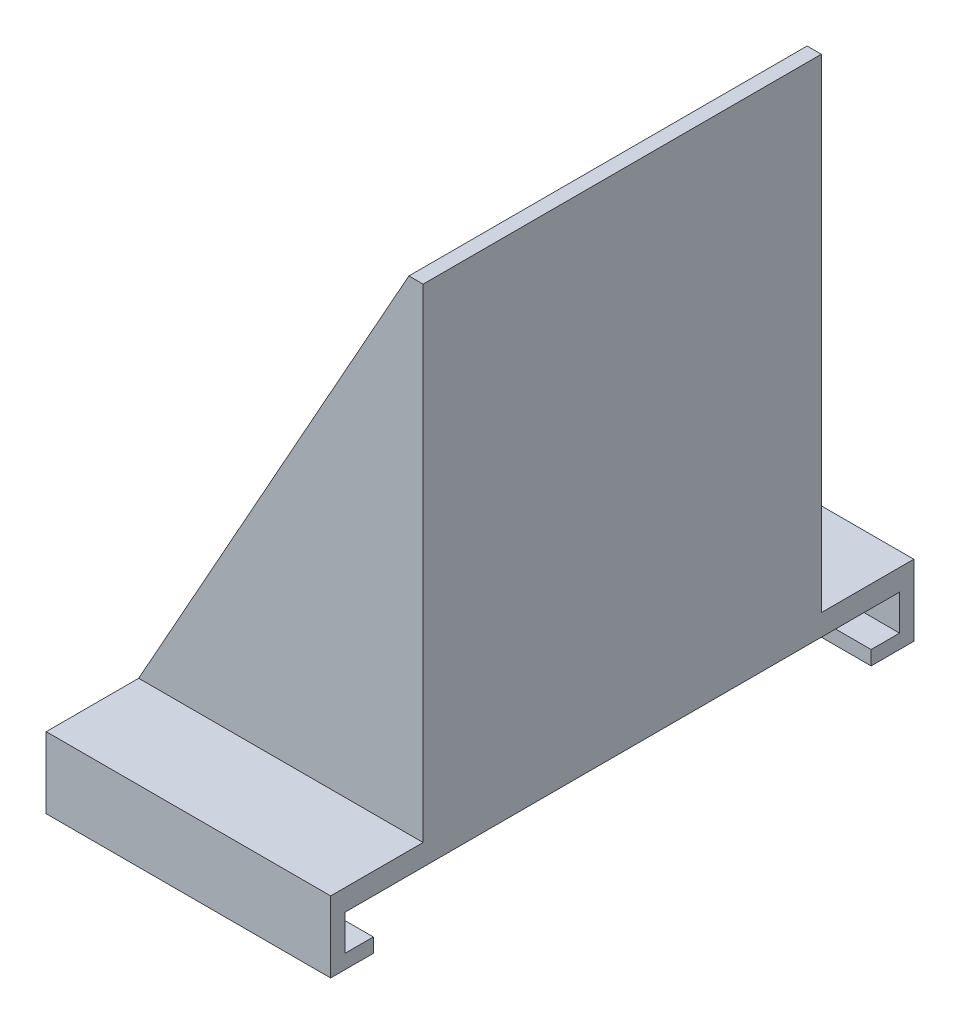
ISO-10303-21;
HEADER;
FILE_DESCRIPTION(('STEP AP214'),'2;1');
FILE_NAME('part.step','',(''),(''),'','','');
FILE_SCHEMA(('AUTOMOTIVE_DESIGN { 1 0 10303 214 1 1 1 1 }'));
ENDSEC;
DATA;
#1=APPLICATION_CONTEXT('core data for automotive mechanical design processes');
#2=APPLICATION_PROTOCOL_DEFINITION('international standard','automotive_design',2000,#1);
#3=PRODUCT_CONTEXT('',#1,'mechanical');
#4=PRODUCT('Part','Part','',(#3));
#5=PRODUCT_RELATED_PRODUCT_CATEGORY('part','',(#4));
#6=PRODUCT_DEFINITION_FORMATION('','',#4);
#7=PRODUCT_DEFINITION_CONTEXT('part definition',#1,'design');
#8=PRODUCT_DEFINITION('design','',#6,#7);
#9=PRODUCT_DEFINITION_SHAPE('','',#8);
#10=(LENGTH_UNIT() NAMED_UNIT(*) SI_UNIT(.MILLI.,.METRE.));
#11=(NAMED_UNIT(*) PLANE_ANGLE_UNIT() SI_UNIT($,.RADIAN.));
#12=(NAMED_UNIT(*) SI_UNIT($,.STERADIAN.) SOLID_ANGLE_UNIT());
#13=UNCERTAINTY_MEASURE_WITH_UNIT(LENGTH_MEASURE(1.E-05),#10,'distance_accuracy_value','');
#14=(GEOMETRIC_REPRESENTATION_CONTEXT(3) GLOBAL_UNCERTAINTY_ASSIGNED_CONTEXT((#13)) GLOBAL_UNIT_ASSIGNED_CONTEXT((#10,
#11,#12)) REPRESENTATION_CONTEXT('',''));
#15=CARTESIAN_POINT('',(0.,0.,0.));
#16=DIRECTION('',(0.,0.,1.));
#17=DIRECTION('',(1.,0.,0.));
#18=AXIS2_PLACEMENT_3D('',#15,#16,#17);
#19=CARTESIAN_POINT('',(51.1489361702127,0.,0.));
#20=DIRECTION('',(-1.,0.,0.));
#21=DIRECTION('',(0.,0.,1.));
#22=AXIS2_PLACEMENT_3D('',#19,#20,#21);
#23=PLANE('',#22);
#24=DIRECTION('',(0.,0.,-1.));
#25=VECTOR('',#24,1.);
#26=CARTESIAN_POINT('',(51.1489361702127,3.5,0.));
#27=LINE('',#26,#25);
#28=CARTESIAN_POINT('',(51.1489361702127,3.5,10.322695035461));
#29=VERTEX_POINT('',#28);
#30=CARTESIAN_POINT('',(51.1489361702127,3.5,-15.677304964539));
#31=VERTEX_POINT('',#30);
#32=EDGE_CURVE('E50',#29,#31,#27,.T.);
#33=ORIENTED_EDGE('',*,*,#32,.F.);
#34=DIRECTION('',(0.,1.,0.));
#35=VECTOR('',#34,1.);
#36=CARTESIAN_POINT('',(51.1489361702127,1.5,10.322695035461));
#37=LINE('',#36,#35);
#38=CARTESIAN_POINT('',(51.1489361702127,35.5,10.322695035461));
#39=VERTEX_POINT('',#38);
#40=EDGE_CURVE('E185',#29,#39,#37,.T.);
#41=ORIENTED_EDGE('',*,*,#40,.T.);
#42=DIRECTION('',(0.,0.,1.));
#43=VECTOR('',#42,1.);
#44=CARTESIAN_POINT('',(51.1489361702127,35.5,11.322695035461));
#45=LINE('',#44,#43);
#46=CARTESIAN_POINT('',(51.1489361702127,35.5,-15.677304964539));
#47=VERTEX_POINT('',#46);
#48=EDGE_CURVE('E205',#47,#39,#45,.T.);
#49=ORIENTED_EDGE('',*,*,#48,.F.);
#50=DIRECTION('',(0.,-1.,0.));
#51=VECTOR('',#50,1.);
#52=CARTESIAN_POINT('',(51.1489361702127,1.5,-15.677304964539));
#53=LINE('',#52,#51);
#54=EDGE_CURVE('E181',#47,#31,#53,.T.);
#55=ORIENTED_EDGE('',*,*,#54,.T.);
#56=EDGE_LOOP('',(#33,#41,#49,#55));
#57=FACE_BOUND('',#56,.T.);
#58=ADVANCED_FACE('F35',(#57),#23,.T.);
#59=CARTESIAN_POINT('',(0.,1.5,0.));
#60=DIRECTION('',(0.,1.,0.));
#61=DIRECTION('',(0.,0.,1.));
#62=AXIS2_PLACEMENT_3D('',#59,#60,#61);
#63=PLANE('',#62);
#64=DIRECTION('',(1.,0.,0.));
#65=VECTOR('',#64,1.);
#66=CARTESIAN_POINT('',(51.1489361702127,1.5,11.322695035461));
#67=LINE('',#66,#65);
#68=CARTESIAN_POINT('',(32.1489361702127,1.5,11.322695035461));
#69=VERTEX_POINT('',#68);
#70=CARTESIAN_POINT('',(52.1489361702127,1.5,11.322695035461));
#71=VERTEX_POINT('',#70);
#72=EDGE_CURVE('E215',#69,#71,#67,.T.);
#73=ORIENTED_EDGE('',*,*,#72,.F.);
#74=DIRECTION('',(0.,0.,1.));
#75=VECTOR('',#74,1.);
#76=CARTESIAN_POINT('',(32.1489361702127,1.5,-23.177304964539));
#77=LINE('',#76,#75);
#78=CARTESIAN_POINT('',(32.1489361702127,1.5,17.822695035461));
#79=VERTEX_POINT('',#78);
#80=EDGE_CURVE('E297',#69,#79,#77,.T.);
#81=ORIENTED_EDGE('',*,*,#80,.T.);
#82=DIRECTION('',(1.,0.,0.));
#83=VECTOR('',#82,1.);
#84=CARTESIAN_POINT('',(32.1489361702127,1.5,17.822695035461));
#85=LINE('',#84,#83);
#86=CARTESIAN_POINT('',(52.1489361702127,1.5,17.822695035461));
#87=VERTEX_POINT('',#86);
#88=EDGE_CURVE('E296',#79,#87,#85,.T.);
#89=ORIENTED_EDGE('',*,*,#88,.T.);
#90=DIRECTION('',(0.,0.,-1.));
#91=VECTOR('',#90,1.);
#92=CARTESIAN_POINT('',(52.1489361702127,1.5,-23.177304964539));
#93=LINE('',#92,#91);
#94=EDGE_CURVE('E300',#87,#71,#93,.T.);
#95=ORIENTED_EDGE('',*,*,#94,.T.);
#96=EDGE_LOOP('',(#73,#81,#89,#95));
#97=FACE_BOUND('',#96,.T.);
#98=ADVANCED_FACE('F339',(#97),#63,.T.);
#99=CARTESIAN_POINT('',(0.,0.,0.));
#100=DIRECTION('',(0.,1.,0.));
#101=DIRECTION('',(0.,0.,1.));
#102=AXIS2_PLACEMENT_3D('',#99,#100,#101);
#103=PLANE('',#102);
#104=DIRECTION('',(0.,0.,1.));
#105=VECTOR('',#104,1.);
#106=CARTESIAN_POINT('',(32.1489361702127,0.,-23.177304964539));
#107=LINE('',#106,#105);
#108=CARTESIAN_POINT('',(32.1489361702127,0.,-22.177304964539));
#109=VERTEX_POINT('',#108);
#110=CARTESIAN_POINT('',(32.1489361702127,0.,16.822695035461));
#111=VERTEX_POINT('',#110);
#112=EDGE_CURVE('E284',#109,#111,#107,.T.);
#113=ORIENTED_EDGE('',*,*,#112,.F.);
#114=DIRECTION('',(1.,0.,0.));
#115=VECTOR('',#114,1.);
#116=CARTESIAN_POINT('',(32.1489361702127,0.,-22.177304964539));
#117=LINE('',#116,#115);
#118=CARTESIAN_POINT('',(52.1489361702127,0.,-22.177304964539));
#119=VERTEX_POINT('',#118);
#120=EDGE_CURVE('E248',#109,#119,#117,.T.);
#121=ORIENTED_EDGE('',*,*,#120,.T.);
#122=DIRECTION('',(0.,0.,-1.));
#123=VECTOR('',#122,1.);
#124=CARTESIAN_POINT('',(52.1489361702127,0.,-23.177304964539));
#125=LINE('',#124,#123);
#126=CARTESIAN_POINT('',(52.1489361702127,0.,16.822695035461));
#127=VERTEX_POINT('',#126);
#128=EDGE_CURVE('E307',#127,#119,#125,.T.);
#129=ORIENTED_EDGE('',*,*,#128,.F.);
#130=DIRECTION('',(1.,0.,0.));
#131=VECTOR('',#130,1.);
#132=CARTESIAN_POINT('',(32.1489361702127,0.,16.822695035461));
#133=LINE('',#132,#131);
#134=EDGE_CURVE('E281',#111,#127,#133,.T.);
#135=ORIENTED_EDGE('',*,*,#134,.F.);
#136=EDGE_LOOP('',(#113,#121,#129,#135));
#137=FACE_BOUND('',#136,.T.);
#138=ADVANCED_FACE('F369',(#137),#103,.F.);
#139=CARTESIAN_POINT('',(32.1489361702127,1.5,-23.177304964539));
#140=DIRECTION('',(1.,0.,0.));
#141=DIRECTION('',(0.,0.,-1.));
#142=AXIS2_PLACEMENT_3D('',#139,#140,#141);
#143=PLANE('',#142);
#144=DIRECTION('',(0.,-1.,0.));
#145=VECTOR('',#144,1.);
#146=CARTESIAN_POINT('',(32.1489361702127,1.5,-23.177304964539));
#147=LINE('',#146,#145);
#148=CARTESIAN_POINT('',(32.1489361702127,1.5,-23.177304964539));
#149=VERTEX_POINT('',#148);
#150=CARTESIAN_POINT('',(32.1489361702127,-3.5,-23.177304964539));
#151=VERTEX_POINT('',#150);
#152=EDGE_CURVE('E305',#149,#151,#147,.T.);
#153=ORIENTED_EDGE('',*,*,#152,.T.);
#154=DIRECTION('',(0.,0.,-1.));
#155=VECTOR('',#154,1.);
#156=CARTESIAN_POINT('',(32.1489361702127,-3.5,-23.177304964539));
#157=LINE('',#156,#155);
#158=CARTESIAN_POINT('',(32.1489361702127,-3.5,-20.177304964539));
#159=VERTEX_POINT('',#158);
#160=EDGE_CURVE('E228',#159,#151,#157,.T.);
#161=ORIENTED_EDGE('',*,*,#160,.F.);
#162=DIRECTION('',(0.,-1.,0.));
#163=VECTOR('',#162,1.);
#164=CARTESIAN_POINT('',(32.1489361702127,-3.5,-20.177304964539));
#165=LINE('',#164,#163);
#166=CARTESIAN_POINT('',(32.1489361702127,-2.5,-20.177304964539));
#167=VERTEX_POINT('',#166);
#168=EDGE_CURVE('E224',#167,#159,#165,.T.);
#169=ORIENTED_EDGE('',*,*,#168,.F.);
#170=DIRECTION('',(0.,0.,1.));
#171=VECTOR('',#170,1.);
#172=CARTESIAN_POINT('',(32.1489361702127,-2.5,-20.177304964539));
#173=LINE('',#172,#171);
#174=CARTESIAN_POINT('',(32.1489361702127,-2.5,-22.177304964539));
#175=VERTEX_POINT('',#174);
#176=EDGE_CURVE('E221',#175,#167,#173,.T.);
#177=ORIENTED_EDGE('',*,*,#176,.F.);
#178=DIRECTION('',(0.,-1.,0.));
#179=VECTOR('',#178,1.);
#180=CARTESIAN_POINT('',(32.1489361702127,-2.5,-22.177304964539));
#181=LINE('',#180,#179);
#182=EDGE_CURVE('E231',#109,#175,#181,.T.);
#183=ORIENTED_EDGE('',*,*,#182,.F.);
#184=ORIENTED_EDGE('',*,*,#112,.T.);
#185=DIRECTION('',(0.,1.,0.));
#186=VECTOR('',#185,1.);
#187=CARTESIAN_POINT('',(32.1489361702127,-2.5,16.822695035461));
#188=LINE('',#187,#186);
#189=CARTESIAN_POINT('',(32.1489361702127,-2.5,16.822695035461));
#190=VERTEX_POINT('',#189);
#191=EDGE_CURVE('E267',#190,#111,#188,.T.);
#192=ORIENTED_EDGE('',*,*,#191,.F.);
#193=DIRECTION('',(0.,0.,1.));
#194=VECTOR('',#193,1.);
#195=CARTESIAN_POINT('',(32.1489361702127,-2.5,14.822695035461));
#196=LINE('',#195,#194);
#197=CARTESIAN_POINT('',(32.1489361702127,-2.5,14.822695035461));
#198=VERTEX_POINT('',#197);
#199=EDGE_CURVE('E264',#198,#190,#196,.T.);
#200=ORIENTED_EDGE('',*,*,#199,.F.);
#201=DIRECTION('',(0.,1.,0.));
#202=VECTOR('',#201,1.);
#203=CARTESIAN_POINT('',(32.1489361702127,-3.5,14.822695035461));
#204=LINE('',#203,#202);
#205=CARTESIAN_POINT('',(32.1489361702127,-3.5,14.822695035461));
#206=VERTEX_POINT('',#205);
#207=EDGE_CURVE('E260',#206,#198,#204,.T.);
#208=ORIENTED_EDGE('',*,*,#207,.F.);
#209=DIRECTION('',(0.,0.,-1.));
#210=VECTOR('',#209,1.);
#211=CARTESIAN_POINT('',(32.1489361702127,-3.5,17.822695035461));
#212=LINE('',#211,#210);
#213=CARTESIAN_POINT('',(32.1489361702127,-3.5,17.822695035461));
#214=VERTEX_POINT('',#213);
#215=EDGE_CURVE('E257',#214,#206,#212,.T.);
#216=ORIENTED_EDGE('',*,*,#215,.F.);
#217=DIRECTION('',(0.,-1.,0.));
#218=VECTOR('',#217,1.);
#219=CARTESIAN_POINT('',(32.1489361702127,1.5,17.822695035461));
#220=LINE('',#219,#218);
#221=EDGE_CURVE('E43',#79,#214,#220,.T.);
#222=ORIENTED_EDGE('',*,*,#221,.F.);
#223=ORIENTED_EDGE('',*,*,#80,.F.);
#224=DIRECTION('',(0.,0.,1.));
#225=VECTOR('',#224,1.);
#226=CARTESIAN_POINT('',(32.1489361702127,1.5,10.322695035461));
#227=LINE('',#226,#225);
#228=CARTESIAN_POINT('',(32.1489361702127,1.5,-16.677304964539));
#229=VERTEX_POINT('',#228);
#230=EDGE_CURVE('E196',#229,#69,#227,.T.);
#231=ORIENTED_EDGE('',*,*,#230,.F.);
#232=EDGE_CURVE('E293',#149,#229,#77,.T.);
#233=ORIENTED_EDGE('',*,*,#232,.F.);
#234=EDGE_LOOP('',(#153,#161,#169,#177,#183,#184,#192,#200,#208,#216,#222,#223,#231,#233));
#235=FACE_BOUND('',#234,.T.);
#236=ADVANCED_FACE('F37',(#235),#143,.F.);
#237=CARTESIAN_POINT('',(32.1489361702127,1.5,17.822695035461));
#238=DIRECTION('',(0.,0.,-1.));
#239=DIRECTION('',(-1.,0.,0.));
#240=AXIS2_PLACEMENT_3D('',#237,#238,#239);
#241=PLANE('',#240);
#242=ORIENTED_EDGE('',*,*,#221,.T.);
#243=DIRECTION('',(1.,0.,0.));
#244=VECTOR('',#243,1.);
#245=CARTESIAN_POINT('',(32.1489361702127,-3.5,17.822695035461));
#246=LINE('',#245,#244);
#247=CARTESIAN_POINT('',(52.1489361702127,-3.5,17.822695035461));
#248=VERTEX_POINT('',#247);
#249=EDGE_CURVE('E270',#214,#248,#246,.T.);
#250=ORIENTED_EDGE('',*,*,#249,.T.);
#251=DIRECTION('',(0.,-1.,0.));
#252=VECTOR('',#251,1.);
#253=CARTESIAN_POINT('',(52.1489361702127,1.5,17.822695035461));
#254=LINE('',#253,#252);
#255=EDGE_CURVE('E313',#87,#248,#254,.T.);
#256=ORIENTED_EDGE('',*,*,#255,.F.);
#257=ORIENTED_EDGE('',*,*,#88,.F.);
#258=EDGE_LOOP('',(#242,#250,#256,#257));
#259=FACE_BOUND('',#258,.T.);
#260=ADVANCED_FACE('F318',(#259),#241,.F.);
#261=CARTESIAN_POINT('',(52.1489361702127,1.5,-23.177304964539));
#262=DIRECTION('',(-1.,0.,0.));
#263=DIRECTION('',(0.,0.,1.));
#264=AXIS2_PLACEMENT_3D('',#261,#262,#263);
#265=PLANE('',#264);
#266=DIRECTION('',(0.,-1.,0.));
#267=VECTOR('',#266,1.);
#268=CARTESIAN_POINT('',(52.1489361702127,1.5,11.322695035461));
#269=LINE('',#268,#267);
#270=CARTESIAN_POINT('',(52.1489361702127,35.5,11.322695035461));
#271=VERTEX_POINT('',#270);
#272=EDGE_CURVE('E210',#271,#71,#269,.T.);
#273=ORIENTED_EDGE('',*,*,#272,.T.);
#274=ORIENTED_EDGE('',*,*,#94,.F.);
#275=ORIENTED_EDGE('',*,*,#255,.T.);
#276=DIRECTION('',(0.,0.,-1.));
#277=VECTOR('',#276,1.);
#278=CARTESIAN_POINT('',(52.1489361702127,-3.5,17.822695035461));
#279=LINE('',#278,#277);
#280=CARTESIAN_POINT('',(52.1489361702127,-3.5,14.822695035461));
#281=VERTEX_POINT('',#280);
#282=EDGE_CURVE('E247',#248,#281,#279,.T.);
#283=ORIENTED_EDGE('',*,*,#282,.T.);
#284=DIRECTION('',(0.,1.,0.));
#285=VECTOR('',#284,1.);
#286=CARTESIAN_POINT('',(52.1489361702127,-3.5,14.822695035461));
#287=LINE('',#286,#285);
#288=CARTESIAN_POINT('',(52.1489361702127,-2.5,14.822695035461));
#289=VERTEX_POINT('',#288);
#290=EDGE_CURVE('E273',#281,#289,#287,.T.);
#291=ORIENTED_EDGE('',*,*,#290,.T.);
#292=DIRECTION('',(0.,0.,1.));
#293=VECTOR('',#292,1.);
#294=CARTESIAN_POINT('',(52.1489361702127,-2.5,14.822695035461));
#295=LINE('',#294,#293);
#296=CARTESIAN_POINT('',(52.1489361702127,-2.5,16.822695035461));
#297=VERTEX_POINT('',#296);
#298=EDGE_CURVE('E276',#289,#297,#295,.T.);
#299=ORIENTED_EDGE('',*,*,#298,.T.);
#300=DIRECTION('',(0.,1.,0.));
#301=VECTOR('',#300,1.);
#302=CARTESIAN_POINT('',(52.1489361702127,-2.5,16.822695035461));
#303=LINE('',#302,#301);
#304=EDGE_CURVE('E261',#297,#127,#303,.T.);
#305=ORIENTED_EDGE('',*,*,#304,.T.);
#306=ORIENTED_EDGE('',*,*,#128,.T.);
#307=DIRECTION('',(0.,-1.,0.));
#308=VECTOR('',#307,1.);
#309=CARTESIAN_POINT('',(52.1489361702127,-2.5,-22.177304964539));
#310=LINE('',#309,#308);
#311=CARTESIAN_POINT('',(52.1489361702127,-2.5,-22.177304964539));
#312=VERTEX_POINT('',#311);
#313=EDGE_CURVE('E225',#119,#312,#310,.T.);
#314=ORIENTED_EDGE('',*,*,#313,.T.);
#315=DIRECTION('',(0.,0.,1.));
#316=VECTOR('',#315,1.);
#317=CARTESIAN_POINT('',(52.1489361702127,-2.5,-20.177304964539));
#318=LINE('',#317,#316);
#319=CARTESIAN_POINT('',(52.1489361702127,-2.5,-20.177304964539));
#320=VERTEX_POINT('',#319);
#321=EDGE_CURVE('E214',#312,#320,#318,.T.);
#322=ORIENTED_EDGE('',*,*,#321,.T.);
#323=DIRECTION('',(0.,-1.,0.));
#324=VECTOR('',#323,1.);
#325=CARTESIAN_POINT('',(52.1489361702127,-3.5,-20.177304964539));
#326=LINE('',#325,#324);
#327=CARTESIAN_POINT('',(52.1489361702127,-3.5,-20.177304964539));
#328=VERTEX_POINT('',#327);
#329=EDGE_CURVE('E237',#320,#328,#326,.T.);
#330=ORIENTED_EDGE('',*,*,#329,.T.);
#331=DIRECTION('',(0.,0.,-1.));
#332=VECTOR('',#331,1.);
#333=CARTESIAN_POINT('',(52.1489361702127,-3.5,-23.177304964539));
#334=LINE('',#333,#332);
#335=CARTESIAN_POINT('',(52.1489361702127,-3.5,-23.177304964539));
#336=VERTEX_POINT('',#335);
#337=EDGE_CURVE('E240',#328,#336,#334,.T.);
#338=ORIENTED_EDGE('',*,*,#337,.T.);
#339=DIRECTION('',(0.,-1.,0.));
#340=VECTOR('',#339,1.);
#341=CARTESIAN_POINT('',(52.1489361702127,1.5,-23.177304964539));
#342=LINE('',#341,#340);
#343=CARTESIAN_POINT('',(52.1489361702127,1.5,-23.177304964539));
#344=VERTEX_POINT('',#343);
#345=EDGE_CURVE('E311',#344,#336,#342,.T.);
#346=ORIENTED_EDGE('',*,*,#345,.F.);
#347=CARTESIAN_POINT('',(52.1489361702127,1.5,-16.677304964539));
#348=VERTEX_POINT('',#347);
#349=EDGE_CURVE('E299',#348,#344,#93,.T.);
#350=ORIENTED_EDGE('',*,*,#349,.F.);
#351=DIRECTION('',(0.,1.,0.));
#352=VECTOR('',#351,1.);
#353=CARTESIAN_POINT('',(52.1489361702127,1.5,-16.677304964539));
#354=LINE('',#353,#352);
#355=CARTESIAN_POINT('',(52.1489361702127,35.5,-16.677304964539));
#356=VERTEX_POINT('',#355);
#357=EDGE_CURVE('E57',#348,#356,#354,.T.);
#358=ORIENTED_EDGE('',*,*,#357,.T.);
#359=DIRECTION('',(0.,0.,1.));
#360=VECTOR('',#359,1.);
#361=CARTESIAN_POINT('',(52.1489361702127,35.5,11.322695035461));
#362=LINE('',#361,#360);
#363=EDGE_CURVE('E207',#356,#271,#362,.T.);
#364=ORIENTED_EDGE('',*,*,#363,.T.);
#365=EDGE_LOOP('',(#273,#274,#275,#283,#291,#299,#305,#306,#314,#322,#330,#338,#346,#350,#358,#364));
#366=FACE_BOUND('',#365,.T.);
#367=ADVANCED_FACE('F334',(#366),#265,.F.);
#368=CARTESIAN_POINT('',(32.1489361702127,1.5,-23.177304964539));
#369=DIRECTION('',(0.,0.,1.));
#370=DIRECTION('',(1.,0.,0.));
#371=AXIS2_PLACEMENT_3D('',#368,#369,#370);
#372=PLANE('',#371);
#373=ORIENTED_EDGE('',*,*,#345,.T.);
#374=DIRECTION('',(1.,0.,0.));
#375=VECTOR('',#374,1.);
#376=CARTESIAN_POINT('',(32.1489361702127,-3.5,-23.177304964539));
#377=LINE('',#376,#375);
#378=EDGE_CURVE('E251',#151,#336,#377,.T.);
#379=ORIENTED_EDGE('',*,*,#378,.F.);
#380=ORIENTED_EDGE('',*,*,#152,.F.);
#381=DIRECTION('',(-1.,0.,0.));
#382=VECTOR('',#381,1.);
#383=CARTESIAN_POINT('',(32.1489361702127,1.5,-23.177304964539));
#384=LINE('',#383,#382);
#385=EDGE_CURVE('E303',#344,#149,#384,.T.);
#386=ORIENTED_EDGE('',*,*,#385,.F.);
#387=EDGE_LOOP('',(#373,#379,#380,#386));
#388=FACE_BOUND('',#387,.T.);
#389=ADVANCED_FACE('F352',(#388),#372,.F.);
#390=ORIENTED_EDGE('',*,*,#232,.T.);
#391=DIRECTION('',(1.,0.,0.));
#392=VECTOR('',#391,1.);
#393=CARTESIAN_POINT('',(51.1489361702127,1.5,-16.677304964539));
#394=LINE('',#393,#392);
#395=EDGE_CURVE('E212',#229,#348,#394,.T.);
#396=ORIENTED_EDGE('',*,*,#395,.T.);
#397=ORIENTED_EDGE('',*,*,#349,.T.);
#398=ORIENTED_EDGE('',*,*,#385,.T.);
#399=EDGE_LOOP('',(#390,#396,#397,#398));
#400=FACE_BOUND('',#399,.T.);
#401=ADVANCED_FACE('F346',(#400),#63,.T.);
#402=CARTESIAN_POINT('',(32.1489361702127,-2.5,16.822695035461));
#403=DIRECTION('',(0.,0.,-1.));
#404=DIRECTION('',(-1.,0.,0.));
#405=AXIS2_PLACEMENT_3D('',#402,#403,#404);
#406=PLANE('',#405);
#407=ORIENTED_EDGE('',*,*,#304,.F.);
#408=DIRECTION('',(1.,0.,0.));
#409=VECTOR('',#408,1.);
#410=CARTESIAN_POINT('',(32.1489361702127,-2.5,16.822695035461));
#411=LINE('',#410,#409);
#412=EDGE_CURVE('E285',#190,#297,#411,.T.);
#413=ORIENTED_EDGE('',*,*,#412,.F.);
#414=ORIENTED_EDGE('',*,*,#191,.T.);
#415=ORIENTED_EDGE('',*,*,#134,.T.);
#416=EDGE_LOOP('',(#407,#413,#414,#415));
#417=FACE_BOUND('',#416,.T.);
#418=ADVANCED_FACE('F373',(#417),#406,.T.);
#419=CARTESIAN_POINT('',(32.1489361702127,-2.5,14.822695035461));
#420=DIRECTION('',(0.,1.,0.));
#421=DIRECTION('',(0.,0.,1.));
#422=AXIS2_PLACEMENT_3D('',#419,#420,#421);
#423=PLANE('',#422);
#424=ORIENTED_EDGE('',*,*,#298,.F.);
#425=DIRECTION('',(1.,0.,0.));
#426=VECTOR('',#425,1.);
#427=CARTESIAN_POINT('',(32.1489361702127,-2.5,14.822695035461));
#428=LINE('',#427,#426);
#429=EDGE_CURVE('E287',#198,#289,#428,.T.);
#430=ORIENTED_EDGE('',*,*,#429,.F.);
#431=ORIENTED_EDGE('',*,*,#199,.T.);
#432=ORIENTED_EDGE('',*,*,#412,.T.);
#433=EDGE_LOOP('',(#424,#430,#431,#432));
#434=FACE_BOUND('',#433,.T.);
#435=ADVANCED_FACE('F375',(#434),#423,.T.);
#436=CARTESIAN_POINT('',(32.1489361702127,-3.5,14.822695035461));
#437=DIRECTION('',(0.,0.,-1.));
#438=DIRECTION('',(-1.,0.,0.));
#439=AXIS2_PLACEMENT_3D('',#436,#437,#438);
#440=PLANE('',#439);
#441=ORIENTED_EDGE('',*,*,#290,.F.);
#442=DIRECTION('',(1.,0.,0.));
#443=VECTOR('',#442,1.);
#444=CARTESIAN_POINT('',(32.1489361702127,-3.5,14.822695035461));
#445=LINE('',#444,#443);
#446=EDGE_CURVE('E289',#206,#281,#445,.T.);
#447=ORIENTED_EDGE('',*,*,#446,.F.);
#448=ORIENTED_EDGE('',*,*,#207,.T.);
#449=ORIENTED_EDGE('',*,*,#429,.T.);
#450=EDGE_LOOP('',(#441,#447,#448,#449));
#451=FACE_BOUND('',#450,.T.);
#452=ADVANCED_FACE('F331',(#451),#440,.T.);
#453=CARTESIAN_POINT('',(32.1489361702127,-3.5,17.822695035461));
#454=DIRECTION('',(0.,-1.,0.));
#455=DIRECTION('',(0.,0.,-1.));
#456=AXIS2_PLACEMENT_3D('',#453,#454,#455);
#457=PLANE('',#456);
#458=ORIENTED_EDGE('',*,*,#282,.F.);
#459=ORIENTED_EDGE('',*,*,#249,.F.);
#460=ORIENTED_EDGE('',*,*,#215,.T.);
#461=ORIENTED_EDGE('',*,*,#446,.T.);
#462=EDGE_LOOP('',(#458,#459,#460,#461));
#463=FACE_BOUND('',#462,.T.);
#464=ADVANCED_FACE('F325',(#463),#457,.T.);
#465=CARTESIAN_POINT('',(32.1489361702127,-2.5,-20.177304964539));
#466=DIRECTION('',(0.,1.,0.));
#467=DIRECTION('',(0.,0.,1.));
#468=AXIS2_PLACEMENT_3D('',#465,#466,#467);
#469=PLANE('',#468);
#470=ORIENTED_EDGE('',*,*,#321,.F.);
#471=DIRECTION('',(1.,0.,0.));
#472=VECTOR('',#471,1.);
#473=CARTESIAN_POINT('',(32.1489361702127,-2.5,-22.177304964539));
#474=LINE('',#473,#472);
#475=EDGE_CURVE('E245',#175,#312,#474,.T.);
#476=ORIENTED_EDGE('',*,*,#475,.F.);
#477=ORIENTED_EDGE('',*,*,#176,.T.);
#478=DIRECTION('',(1.,0.,0.));
#479=VECTOR('',#478,1.);
#480=CARTESIAN_POINT('',(32.1489361702127,-2.5,-20.177304964539));
#481=LINE('',#480,#479);
#482=EDGE_CURVE('E234',#167,#320,#481,.T.);
#483=ORIENTED_EDGE('',*,*,#482,.T.);
#484=EDGE_LOOP('',(#470,#476,#477,#483));
#485=FACE_BOUND('',#484,.T.);
#486=ADVANCED_FACE('F363',(#485),#469,.T.);
#487=CARTESIAN_POINT('',(32.1489361702127,-2.5,-22.177304964539));
#488=DIRECTION('',(0.,0.,1.));
#489=DIRECTION('',(1.,0.,0.));
#490=AXIS2_PLACEMENT_3D('',#487,#488,#489);
#491=PLANE('',#490);
#492=ORIENTED_EDGE('',*,*,#313,.F.);
#493=ORIENTED_EDGE('',*,*,#120,.F.);
#494=ORIENTED_EDGE('',*,*,#182,.T.);
#495=ORIENTED_EDGE('',*,*,#475,.T.);
#496=EDGE_LOOP('',(#492,#493,#494,#495));
#497=FACE_BOUND('',#496,.T.);
#498=ADVANCED_FACE('F367',(#497),#491,.T.);
#499=CARTESIAN_POINT('',(32.1489361702127,-3.5,-23.177304964539));
#500=DIRECTION('',(0.,-1.,0.));
#501=DIRECTION('',(0.,0.,-1.));
#502=AXIS2_PLACEMENT_3D('',#499,#500,#501);
#503=PLANE('',#502);
#504=ORIENTED_EDGE('',*,*,#337,.F.);
#505=DIRECTION('',(1.,0.,0.));
#506=VECTOR('',#505,1.);
#507=CARTESIAN_POINT('',(32.1489361702127,-3.5,-20.177304964539));
#508=LINE('',#507,#506);
#509=EDGE_CURVE('E254',#159,#328,#508,.T.);
#510=ORIENTED_EDGE('',*,*,#509,.F.);
#511=ORIENTED_EDGE('',*,*,#160,.T.);
#512=ORIENTED_EDGE('',*,*,#378,.T.);
#513=EDGE_LOOP('',(#504,#510,#511,#512));
#514=FACE_BOUND('',#513,.T.);
#515=ADVANCED_FACE('F406',(#514),#503,.T.);
#516=CARTESIAN_POINT('',(32.1489361702127,-3.5,-20.177304964539));
#517=DIRECTION('',(0.,0.,1.));
#518=DIRECTION('',(1.,0.,0.));
#519=AXIS2_PLACEMENT_3D('',#516,#517,#518);
#520=PLANE('',#519);
#521=ORIENTED_EDGE('',*,*,#329,.F.);
#522=ORIENTED_EDGE('',*,*,#482,.F.);
#523=ORIENTED_EDGE('',*,*,#168,.T.);
#524=ORIENTED_EDGE('',*,*,#509,.T.);
#525=EDGE_LOOP('',(#521,#522,#523,#524));
#526=FACE_BOUND('',#525,.T.);
#527=ADVANCED_FACE('F359',(#526),#520,.T.);
#528=CARTESIAN_POINT('',(51.1489361702127,1.5,-16.677304964539));
#529=DIRECTION('',(0.,0.,-1.));
#530=DIRECTION('',(-1.,0.,0.));
#531=AXIS2_PLACEMENT_3D('',#528,#529,#530);
#532=PLANE('',#531);
#533=DIRECTION('',(1.,0.,0.));
#534=VECTOR('',#533,1.);
#535=CARTESIAN_POINT('',(51.1489361702127,35.5,-16.677304964539));
#536=LINE('',#535,#534);
#537=CARTESIAN_POINT('',(51.1489361702127,35.5,-16.677304964539));
#538=VERTEX_POINT('',#537);
#539=EDGE_CURVE('E204',#538,#356,#536,.T.);
#540=ORIENTED_EDGE('',*,*,#539,.T.);
#541=ORIENTED_EDGE('',*,*,#357,.F.);
#542=ORIENTED_EDGE('',*,*,#395,.F.);
#543=DIRECTION('',(0.487821357664942,0.872943482137265,0.));
#544=VECTOR('',#543,1.);
#545=CARTESIAN_POINT('',(51.1489361702127,35.5,-16.677304964539));
#546=LINE('',#545,#544);
#547=EDGE_CURVE('E187',#229,#538,#546,.T.);
#548=ORIENTED_EDGE('',*,*,#547,.T.);
#549=EDGE_LOOP('',(#540,#541,#542,#548));
#550=FACE_BOUND('',#549,.T.);
#551=ADVANCED_FACE('F342',(#550),#532,.T.);
#552=CARTESIAN_POINT('',(51.1489361702127,1.5,11.322695035461));
#553=DIRECTION('',(0.,0.,1.));
#554=DIRECTION('',(1.,0.,0.));
#555=AXIS2_PLACEMENT_3D('',#552,#553,#554);
#556=PLANE('',#555);
#557=DIRECTION('',(-0.487821357664942,-0.872943482137265,0.));
#558=VECTOR('',#557,1.);
#559=CARTESIAN_POINT('',(51.1489361702127,35.5,11.322695035461));
#560=LINE('',#559,#558);
#561=CARTESIAN_POINT('',(51.1489361702127,35.5,11.322695035461));
#562=VERTEX_POINT('',#561);
#563=EDGE_CURVE('E183',#562,#69,#560,.T.);
#564=ORIENTED_EDGE('',*,*,#563,.T.);
#565=ORIENTED_EDGE('',*,*,#72,.T.);
#566=ORIENTED_EDGE('',*,*,#272,.F.);
#567=DIRECTION('',(1.,0.,0.));
#568=VECTOR('',#567,1.);
#569=CARTESIAN_POINT('',(51.1489361702127,35.5,11.322695035461));
#570=LINE('',#569,#568);
#571=EDGE_CURVE('E218',#562,#271,#570,.T.);
#572=ORIENTED_EDGE('',*,*,#571,.F.);
#573=EDGE_LOOP('',(#564,#565,#566,#572));
#574=FACE_BOUND('',#573,.T.);
#575=ADVANCED_FACE('F394',(#574),#556,.T.);
#576=CARTESIAN_POINT('',(51.1489361702127,35.5,11.322695035461));
#577=DIRECTION('',(0.,1.,0.));
#578=DIRECTION('',(0.,0.,1.));
#579=AXIS2_PLACEMENT_3D('',#576,#577,#578);
#580=PLANE('',#579);
#581=ORIENTED_EDGE('',*,*,#363,.F.);
#582=ORIENTED_EDGE('',*,*,#539,.F.);
#583=EDGE_CURVE('E201',#538,#47,#45,.T.);
#584=ORIENTED_EDGE('',*,*,#583,.T.);
#585=ORIENTED_EDGE('',*,*,#48,.T.);
#586=DIRECTION('',(0.,0.,1.));
#587=VECTOR('',#586,1.);
#588=CARTESIAN_POINT('',(51.1489361702127,35.5,10.322695035461));
#589=LINE('',#588,#587);
#590=EDGE_CURVE('E194',#39,#562,#589,.T.);
#591=ORIENTED_EDGE('',*,*,#590,.T.);
#592=ORIENTED_EDGE('',*,*,#571,.T.);
#593=EDGE_LOOP('',(#581,#582,#584,#585,#591,#592));
#594=FACE_BOUND('',#593,.T.);
#595=ADVANCED_FACE('F397',(#594),#580,.T.);
#596=CARTESIAN_POINT('',(51.1489361702127,35.5,10.322695035461));
#597=DIRECTION('',(-0.872943482137265,0.487821357664942,0.));
#598=DIRECTION('',(-0.487821357664942,-0.872943482137265,0.));
#599=AXIS2_PLACEMENT_3D('',#596,#597,#598);
#600=PLANE('',#599);
#601=DIRECTION('',(-0.487821357664942,-0.872943482137265,0.));
#602=VECTOR('',#601,1.);
#603=CARTESIAN_POINT('',(51.1489361702127,35.5,10.322695035461));
#604=LINE('',#603,#602);
#605=CARTESIAN_POINT('',(33.2665832290363,3.5,10.322695035461));
#606=VERTEX_POINT('',#605);
#607=EDGE_CURVE('E178',#39,#606,#604,.T.);
#608=ORIENTED_EDGE('',*,*,#607,.T.);
#609=DIRECTION('',(0.,0.,1.));
#610=VECTOR('',#609,1.);
#611=CARTESIAN_POINT('',(33.2665832290363,3.5,-16.677304964539));
#612=LINE('',#611,#610);
#613=CARTESIAN_POINT('',(33.2665832290363,3.5,-15.677304964539));
#614=VERTEX_POINT('',#613);
#615=EDGE_CURVE('E165',#614,#606,#612,.T.);
#616=ORIENTED_EDGE('',*,*,#615,.F.);
#617=DIRECTION('',(0.487821357664942,0.872943482137265,0.));
#618=VECTOR('',#617,1.);
#619=CARTESIAN_POINT('',(51.1489361702127,35.5,-15.677304964539));
#620=LINE('',#619,#618);
#621=EDGE_CURVE('E175',#614,#47,#620,.T.);
#622=ORIENTED_EDGE('',*,*,#621,.T.);
#623=ORIENTED_EDGE('',*,*,#583,.F.);
#624=ORIENTED_EDGE('',*,*,#547,.F.);
#625=ORIENTED_EDGE('',*,*,#230,.T.);
#626=ORIENTED_EDGE('',*,*,#563,.F.);
#627=ORIENTED_EDGE('',*,*,#590,.F.);
#628=EDGE_LOOP('',(#608,#616,#622,#623,#624,#625,#626,#627));
#629=FACE_BOUND('',#628,.T.);
#630=ADVANCED_FACE('F173',(#629),#600,.T.);
#631=CARTESIAN_POINT('',(0.,0.,10.322695035461));
#632=DIRECTION('',(0.,0.,-1.));
#633=DIRECTION('',(-1.,0.,0.));
#634=AXIS2_PLACEMENT_3D('',#631,#632,#633);
#635=PLANE('',#634);
#636=DIRECTION('',(1.,0.,0.));
#637=VECTOR('',#636,1.);
#638=CARTESIAN_POINT('',(0.,3.5,10.322695035461));
#639=LINE('',#638,#637);
#640=EDGE_CURVE('E192',#606,#29,#639,.T.);
#641=ORIENTED_EDGE('',*,*,#640,.F.);
#642=ORIENTED_EDGE('',*,*,#607,.F.);
#643=ORIENTED_EDGE('',*,*,#40,.F.);
#644=EDGE_LOOP('',(#641,#642,#643));
#645=FACE_BOUND('',#644,.T.);
#646=ADVANCED_FACE('F470',(#645),#635,.T.);
#647=CARTESIAN_POINT('',(0.,0.,-15.677304964539));
#648=DIRECTION('',(0.,0.,-1.));
#649=DIRECTION('',(-1.,0.,0.));
#650=AXIS2_PLACEMENT_3D('',#647,#648,#649);
#651=PLANE('',#650);
#652=ORIENTED_EDGE('',*,*,#621,.F.);
#653=DIRECTION('',(1.,0.,0.));
#654=VECTOR('',#653,1.);
#655=CARTESIAN_POINT('',(0.,3.5,-15.677304964539));
#656=LINE('',#655,#654);
#657=EDGE_CURVE('E11',#614,#31,#656,.T.);
#658=ORIENTED_EDGE('',*,*,#657,.T.);
#659=ORIENTED_EDGE('',*,*,#54,.F.);
#660=EDGE_LOOP('',(#652,#658,#659));
#661=FACE_BOUND('',#660,.T.);
#662=ADVANCED_FACE('F180',(#661),#651,.F.);
#663=CARTESIAN_POINT('',(52.1489361702127,3.5,-16.677304964539));
#664=DIRECTION('',(0.,1.,0.));
#665=DIRECTION('',(-1.,0.,0.));
#666=AXIS2_PLACEMENT_3D('',#663,#664,#665);
#667=PLANE('',#666);
#668=ORIENTED_EDGE('',*,*,#615,.T.);
#669=ORIENTED_EDGE('',*,*,#640,.T.);
#670=ORIENTED_EDGE('',*,*,#32,.T.);
#671=ORIENTED_EDGE('',*,*,#657,.F.);
#672=EDGE_LOOP('',(#668,#669,#670,#671));
#673=FACE_BOUND('',#672,.T.);
#674=ADVANCED_FACE('F164',(#673),#667,.T.);
#675=CLOSED_SHELL('',(#58,#98,#138,#236,#260,#367,#389,#401,#418,#435,#452,#464,#486,#498,#515,
#527,#551,#575,#595,#630,#646,#662,#674));
#676=MANIFOLD_SOLID_BREP('B2',#675);
#677=ADVANCED_BREP_SHAPE_REPRESENTATION('',(#18,#676),#14);
#678=SHAPE_DEFINITION_REPRESENTATION(#9,#677);
ENDSEC;
END-ISO-10303-21;
